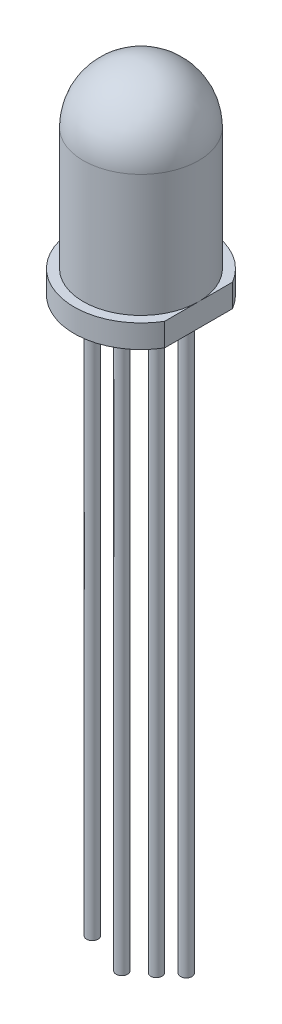
ISO-10303-21;
HEADER;
FILE_DESCRIPTION(('STEP AP214'),'2;1');
FILE_NAME('part.step','',(''),(''),'','','');
FILE_SCHEMA(('AUTOMOTIVE_DESIGN { 1 0 10303 214 1 1 1 1 }'));
ENDSEC;
DATA;
#1=APPLICATION_CONTEXT('core data for automotive mechanical design processes');
#2=APPLICATION_PROTOCOL_DEFINITION('international standard','automotive_design',2000,#1);
#3=PRODUCT_CONTEXT('',#1,'mechanical');
#4=PRODUCT('Part','Part','',(#3));
#5=PRODUCT_RELATED_PRODUCT_CATEGORY('part','',(#4));
#6=PRODUCT_DEFINITION_FORMATION('','',#4);
#7=PRODUCT_DEFINITION_CONTEXT('part definition',#1,'design');
#8=PRODUCT_DEFINITION('design','',#6,#7);
#9=PRODUCT_DEFINITION_SHAPE('','',#8);
#10=(LENGTH_UNIT() NAMED_UNIT(*) SI_UNIT(.MILLI.,.METRE.));
#11=(NAMED_UNIT(*) PLANE_ANGLE_UNIT() SI_UNIT($,.RADIAN.));
#12=(NAMED_UNIT(*) SI_UNIT($,.STERADIAN.) SOLID_ANGLE_UNIT());
#13=UNCERTAINTY_MEASURE_WITH_UNIT(LENGTH_MEASURE(1.E-05),#10,'distance_accuracy_value','');
#14=(GEOMETRIC_REPRESENTATION_CONTEXT(3) GLOBAL_UNCERTAINTY_ASSIGNED_CONTEXT((#13)) GLOBAL_UNIT_ASSIGNED_CONTEXT((#10,
#11,#12)) REPRESENTATION_CONTEXT('',''));
#15=CARTESIAN_POINT('',(0.,0.,0.));
#16=DIRECTION('',(0.,0.,1.));
#17=DIRECTION('',(1.,0.,0.));
#18=AXIS2_PLACEMENT_3D('',#15,#16,#17);
#19=CARTESIAN_POINT('',(0.,0.,0.));
#20=DIRECTION('',(0.,1.,0.));
#21=DIRECTION('',(1.,0.,0.));
#22=AXIS2_PLACEMENT_3D('',#19,#20,#21);
#23=SPHERICAL_SURFACE('',#22,2.5);
#24=CARTESIAN_POINT('',(0.,0.,0.));
#25=DIRECTION('',(0.,1.,0.));
#26=DIRECTION('',(-1.,0.,0.));
#27=AXIS2_PLACEMENT_3D('',#24,#25,#26);
#28=CIRCLE('',#27,2.5);
#29=CARTESIAN_POINT('',(-2.5,0.,0.));
#30=VERTEX_POINT('',#29);
#31=EDGE_CURVE('E110',#30,#30,#28,.T.);
#32=ORIENTED_EDGE('',*,*,#31,.T.);
#33=EDGE_LOOP('',(#32));
#34=FACE_BOUND('',#33,.T.);
#35=ADVANCED_FACE('F53',(#34),#23,.T.);
#36=CARTESIAN_POINT('',(0.,-6.3,0.));
#37=DIRECTION('',(0.,1.,0.));
#38=DIRECTION('',(-1.,0.,0.));
#39=AXIS2_PLACEMENT_3D('',#36,#37,#38);
#40=PLANE('',#39);
#41=CARTESIAN_POINT('',(-2.10983163233935,-6.3,0.));
#42=DIRECTION('',(0.,1.,0.));
#43=DIRECTION('',(-1.,0.,0.));
#44=AXIS2_PLACEMENT_3D('',#41,#42,#43);
#45=CIRCLE('',#44,0.25);
#46=CARTESIAN_POINT('',(-2.35983163233935,-6.3,0.));
#47=VERTEX_POINT('',#46);
#48=EDGE_CURVE('E125',#47,#47,#45,.F.);
#49=ORIENTED_EDGE('',*,*,#48,.F.);
#50=EDGE_LOOP('',(#49));
#51=FACE_BOUND('',#50,.T.);
#52=CARTESIAN_POINT('',(-0.828847000892224,-6.3,0.));
#53=DIRECTION('',(0.,1.,0.));
#54=DIRECTION('',(-1.,0.,0.));
#55=AXIS2_PLACEMENT_3D('',#52,#53,#54);
#56=CIRCLE('',#55,0.25);
#57=CARTESIAN_POINT('',(-1.07884700089222,-6.3,0.));
#58=VERTEX_POINT('',#57);
#59=EDGE_CURVE('E121',#58,#58,#56,.F.);
#60=ORIENTED_EDGE('',*,*,#59,.F.);
#61=EDGE_LOOP('',(#60));
#62=FACE_BOUND('',#61,.T.);
#63=CARTESIAN_POINT('',(0.669516840739869,-6.3,0.));
#64=DIRECTION('',(0.,1.,0.));
#65=DIRECTION('',(-1.,0.,0.));
#66=AXIS2_PLACEMENT_3D('',#63,#64,#65);
#67=CIRCLE('',#66,0.25);
#68=CARTESIAN_POINT('',(0.419516840739869,-6.3,0.));
#69=VERTEX_POINT('',#68);
#70=EDGE_CURVE('E117',#69,#69,#67,.F.);
#71=ORIENTED_EDGE('',*,*,#70,.F.);
#72=EDGE_LOOP('',(#71));
#73=FACE_BOUND('',#72,.T.);
#74=CARTESIAN_POINT('',(1.96602855862878,-6.3,0.));
#75=DIRECTION('',(0.,1.,0.));
#76=DIRECTION('',(-1.,0.,0.));
#77=AXIS2_PLACEMENT_3D('',#74,#75,#76);
#78=CIRCLE('',#77,0.25);
#79=CARTESIAN_POINT('',(1.71602855862878,-6.3,0.));
#80=VERTEX_POINT('',#79);
#81=EDGE_CURVE('E108',#80,#80,#78,.F.);
#82=ORIENTED_EDGE('',*,*,#81,.F.);
#83=EDGE_LOOP('',(#82));
#84=FACE_BOUND('',#83,.T.);
#85=CARTESIAN_POINT('',(0.,-6.3,0.));
#86=DIRECTION('',(0.,1.,0.));
#87=DIRECTION('',(-1.,0.,0.));
#88=AXIS2_PLACEMENT_3D('',#85,#86,#87);
#89=CIRCLE('',#88,2.9);
#90=CARTESIAN_POINT('',(2.5,-6.3,-1.46969384566991));
#91=VERTEX_POINT('',#90);
#92=CARTESIAN_POINT('',(2.5,-6.3,1.46969384566991));
#93=VERTEX_POINT('',#92);
#94=EDGE_CURVE('E98',#91,#93,#89,.T.);
#95=ORIENTED_EDGE('',*,*,#94,.F.);
#96=DIRECTION('',(0.,0.,-1.));
#97=VECTOR('',#96,1.);
#98=CARTESIAN_POINT('',(2.5,-6.3,-1.46969384566991));
#99=LINE('',#98,#97);
#100=EDGE_CURVE('E100',#93,#91,#99,.T.);
#101=ORIENTED_EDGE('',*,*,#100,.F.);
#102=EDGE_LOOP('',(#95,#101));
#103=FACE_BOUND('',#102,.T.);
#104=ADVANCED_FACE('F163',(#51,#62,#73,#84,#103),#40,.F.);
#105=CARTESIAN_POINT('',(0.,2.5,0.));
#106=DIRECTION('',(0.,1.,0.));
#107=DIRECTION('',(-1.,0.,0.));
#108=AXIS2_PLACEMENT_3D('',#105,#106,#107);
#109=CYLINDRICAL_SURFACE('',#108,2.9);
#110=ORIENTED_EDGE('',*,*,#94,.T.);
#111=DIRECTION('',(0.,-1.,0.));
#112=VECTOR('',#111,1.);
#113=CARTESIAN_POINT('',(2.5,2.501,1.46969384566991));
#114=LINE('',#113,#112);
#115=CARTESIAN_POINT('',(2.5,-5.3,1.46969384566991));
#116=VERTEX_POINT('',#115);
#117=EDGE_CURVE('E84',#116,#93,#114,.T.);
#118=ORIENTED_EDGE('',*,*,#117,.F.);
#119=CARTESIAN_POINT('',(0.,-5.3,0.));
#120=DIRECTION('',(0.,1.,0.));
#121=DIRECTION('',(-1.,0.,0.));
#122=AXIS2_PLACEMENT_3D('',#119,#120,#121);
#123=CIRCLE('',#122,2.9);
#124=CARTESIAN_POINT('',(2.5,-5.3,-1.46969384566991));
#125=VERTEX_POINT('',#124);
#126=EDGE_CURVE('E96',#125,#116,#123,.T.);
#127=ORIENTED_EDGE('',*,*,#126,.F.);
#128=DIRECTION('',(0.,-1.,0.));
#129=VECTOR('',#128,1.);
#130=CARTESIAN_POINT('',(2.5,2.501,-1.46969384566991));
#131=LINE('',#130,#129);
#132=EDGE_CURVE('E69',#125,#91,#131,.T.);
#133=ORIENTED_EDGE('',*,*,#132,.T.);
#134=EDGE_LOOP('',(#110,#118,#127,#133));
#135=FACE_BOUND('',#134,.T.);
#136=ADVANCED_FACE('F95',(#135),#109,.T.);
#137=CARTESIAN_POINT('',(2.9,-5.3,0.));
#138=DIRECTION('',(0.,-1.,0.));
#139=DIRECTION('',(1.,0.,0.));
#140=AXIS2_PLACEMENT_3D('',#137,#138,#139);
#141=PLANE('',#140);
#142=ORIENTED_EDGE('',*,*,#126,.T.);
#143=DIRECTION('',(0.,0.,1.));
#144=VECTOR('',#143,1.);
#145=CARTESIAN_POINT('',(2.5,-5.3,-1.46969384566991));
#146=LINE('',#145,#144);
#147=CARTESIAN_POINT('',(2.5,-5.3,0.));
#148=VERTEX_POINT('',#147);
#149=EDGE_CURVE('E81',#148,#116,#146,.T.);
#150=ORIENTED_EDGE('',*,*,#149,.F.);
#151=CARTESIAN_POINT('',(0.,-5.3,0.));
#152=DIRECTION('',(0.,1.,0.));
#153=DIRECTION('',(-1.,0.,0.));
#154=AXIS2_PLACEMENT_3D('',#151,#152,#153);
#155=CIRCLE('',#154,2.5);
#156=EDGE_CURVE('E104',#148,#148,#155,.T.);
#157=ORIENTED_EDGE('',*,*,#156,.F.);
#158=EDGE_CURVE('E73',#125,#148,#146,.T.);
#159=ORIENTED_EDGE('',*,*,#158,.F.);
#160=EDGE_LOOP('',(#142,#150,#157,#159));
#161=FACE_BOUND('',#160,.T.);
#162=ADVANCED_FACE('F102',(#161),#141,.F.);
#163=CARTESIAN_POINT('',(0.,2.5,0.));
#164=DIRECTION('',(0.,1.,0.));
#165=DIRECTION('',(-1.,0.,0.));
#166=AXIS2_PLACEMENT_3D('',#163,#164,#165);
#167=CYLINDRICAL_SURFACE('',#166,2.5);
#168=ORIENTED_EDGE('',*,*,#31,.F.);
#169=EDGE_LOOP('',(#168));
#170=FACE_BOUND('',#169,.T.);
#171=ORIENTED_EDGE('',*,*,#156,.T.);
#172=EDGE_LOOP('',(#171));
#173=FACE_BOUND('',#172,.T.);
#174=ADVANCED_FACE('F151',(#170,#173),#167,.T.);
#175=CARTESIAN_POINT('',(2.5,2.501,-1.46969384566991));
#176=DIRECTION('',(-1.,0.,0.));
#177=DIRECTION('',(0.,-1.,0.));
#178=AXIS2_PLACEMENT_3D('',#175,#176,#177);
#179=PLANE('',#178);
#180=ORIENTED_EDGE('',*,*,#158,.T.);
#181=ORIENTED_EDGE('',*,*,#149,.T.);
#182=ORIENTED_EDGE('',*,*,#117,.T.);
#183=ORIENTED_EDGE('',*,*,#100,.T.);
#184=ORIENTED_EDGE('',*,*,#132,.F.);
#185=EDGE_LOOP('',(#180,#181,#182,#183,#184));
#186=FACE_BOUND('',#185,.T.);
#187=ADVANCED_FACE('F83',(#186),#179,.F.);
#188=CARTESIAN_POINT('',(1.96602855862878,-32.8,0.));
#189=DIRECTION('',(0.,1.,0.));
#190=DIRECTION('',(-1.,0.,0.));
#191=AXIS2_PLACEMENT_3D('',#188,#189,#190);
#192=CYLINDRICAL_SURFACE('',#191,0.25);
#193=CARTESIAN_POINT('',(1.96602855862878,-30.8017377383294,0.));
#194=DIRECTION('',(0.,1.,0.));
#195=DIRECTION('',(0.,0.,1.));
#196=AXIS2_PLACEMENT_3D('',#193,#194,#195);
#197=CIRCLE('',#196,0.25);
#198=CARTESIAN_POINT('',(1.96602855862878,-30.8017377383294,0.25));
#199=VERTEX_POINT('',#198);
#200=EDGE_CURVE('E56',#199,#199,#197,.T.);
#201=ORIENTED_EDGE('',*,*,#200,.T.);
#202=EDGE_LOOP('',(#201));
#203=FACE_BOUND('',#202,.T.);
#204=ORIENTED_EDGE('',*,*,#81,.T.);
#205=EDGE_LOOP('',(#204));
#206=FACE_BOUND('',#205,.T.);
#207=ADVANCED_FACE('F159',(#203,#206),#192,.T.);
#208=CARTESIAN_POINT('',(0.669516840739872,-32.8,0.));
#209=DIRECTION('',(0.,1.,0.));
#210=DIRECTION('',(-1.,0.,0.));
#211=AXIS2_PLACEMENT_3D('',#208,#209,#210);
#212=CYLINDRICAL_SURFACE('',#211,0.25);
#213=CARTESIAN_POINT('',(0.669516840739872,-31.4366469746687,0.));
#214=DIRECTION('',(0.,1.,0.));
#215=DIRECTION('',(0.,0.,1.));
#216=AXIS2_PLACEMENT_3D('',#213,#214,#215);
#217=CIRCLE('',#216,0.25);
#218=CARTESIAN_POINT('',(0.669516840739872,-31.4366469746687,0.25));
#219=VERTEX_POINT('',#218);
#220=EDGE_CURVE('E13',#219,#219,#217,.T.);
#221=ORIENTED_EDGE('',*,*,#220,.T.);
#222=EDGE_LOOP('',(#221));
#223=FACE_BOUND('',#222,.T.);
#224=ORIENTED_EDGE('',*,*,#70,.T.);
#225=EDGE_LOOP('',(#224));
#226=FACE_BOUND('',#225,.T.);
#227=ADVANCED_FACE('F182',(#223,#226),#212,.T.);
#228=CARTESIAN_POINT('',(-0.82884700089222,-32.8,0.));
#229=DIRECTION('',(0.,1.,0.));
#230=DIRECTION('',(-1.,0.,0.));
#231=AXIS2_PLACEMENT_3D('',#228,#229,#230);
#232=CYLINDRICAL_SURFACE('',#231,0.25);
#233=CARTESIAN_POINT('',(-0.82884700089222,-32.1125992848152,0.));
#234=DIRECTION('',(0.,1.,0.));
#235=DIRECTION('',(0.,0.,1.));
#236=AXIS2_PLACEMENT_3D('',#233,#234,#235);
#237=CIRCLE('',#236,0.25);
#238=CARTESIAN_POINT('',(-0.82884700089222,-32.1125992848152,0.25));
#239=VERTEX_POINT('',#238);
#240=EDGE_CURVE('E132',#239,#239,#237,.T.);
#241=ORIENTED_EDGE('',*,*,#240,.T.);
#242=EDGE_LOOP('',(#241));
#243=FACE_BOUND('',#242,.T.);
#244=ORIENTED_EDGE('',*,*,#59,.T.);
#245=EDGE_LOOP('',(#244));
#246=FACE_BOUND('',#245,.T.);
#247=ADVANCED_FACE('F187',(#243,#246),#232,.T.);
#248=CARTESIAN_POINT('',(-2.10983163233935,-32.8,0.));
#249=DIRECTION('',(0.,1.,0.));
#250=DIRECTION('',(-1.,0.,0.));
#251=AXIS2_PLACEMENT_3D('',#248,#249,#250);
#252=CYLINDRICAL_SURFACE('',#251,0.25);
#253=CARTESIAN_POINT('',(-2.10983163233935,-31.4366469746687,0.));
#254=DIRECTION('',(0.,1.,0.));
#255=DIRECTION('',(0.,0.,1.));
#256=AXIS2_PLACEMENT_3D('',#253,#254,#255);
#257=CIRCLE('',#256,0.25);
#258=CARTESIAN_POINT('',(-2.10983163233935,-31.4366469746687,0.25));
#259=VERTEX_POINT('',#258);
#260=EDGE_CURVE('E62',#259,#259,#257,.T.);
#261=ORIENTED_EDGE('',*,*,#260,.T.);
#262=EDGE_LOOP('',(#261));
#263=FACE_BOUND('',#262,.T.);
#264=ORIENTED_EDGE('',*,*,#48,.T.);
#265=EDGE_LOOP('',(#264));
#266=FACE_BOUND('',#265,.T.);
#267=ADVANCED_FACE('F193',(#263,#266),#252,.T.);
#268=CARTESIAN_POINT('',(-1.85983163233935,-31.4366469746687,-2.9));
#269=DIRECTION('',(0.,1.,0.));
#270=DIRECTION('',(0.,0.,1.));
#271=AXIS2_PLACEMENT_3D('',#268,#269,#270);
#272=PLANE('',#271);
#273=ORIENTED_EDGE('',*,*,#260,.F.);
#274=EDGE_LOOP('',(#273));
#275=FACE_BOUND('',#274,.T.);
#276=ADVANCED_FACE('F196',(#275),#272,.F.);
#277=CARTESIAN_POINT('',(-0.318229125149116,-32.1125992848152,-2.9));
#278=DIRECTION('',(0.,1.,0.));
#279=DIRECTION('',(0.,0.,1.));
#280=AXIS2_PLACEMENT_3D('',#277,#278,#279);
#281=PLANE('',#280);
#282=ORIENTED_EDGE('',*,*,#240,.F.);
#283=EDGE_LOOP('',(#282));
#284=FACE_BOUND('',#283,.T.);
#285=ADVANCED_FACE('F205',(#284),#281,.F.);
#286=CARTESIAN_POINT('',(0.919516840739872,-31.4366469746687,-2.9));
#287=DIRECTION('',(0.,1.,0.));
#288=DIRECTION('',(0.,0.,1.));
#289=AXIS2_PLACEMENT_3D('',#286,#287,#288);
#290=PLANE('',#289);
#291=ORIENTED_EDGE('',*,*,#220,.F.);
#292=EDGE_LOOP('',(#291));
#293=FACE_BOUND('',#292,.T.);
#294=ADVANCED_FACE('F201',(#293),#290,.F.);
#295=CARTESIAN_POINT('',(2.21602855862878,-30.8017377383294,-2.9));
#296=DIRECTION('',(0.,1.,0.));
#297=DIRECTION('',(0.,0.,1.));
#298=AXIS2_PLACEMENT_3D('',#295,#296,#297);
#299=PLANE('',#298);
#300=ORIENTED_EDGE('',*,*,#200,.F.);
#301=EDGE_LOOP('',(#300));
#302=FACE_BOUND('',#301,.T.);
#303=ADVANCED_FACE('F198',(#302),#299,.F.);
#304=CLOSED_SHELL('',(#35,#104,#136,#162,#174,#187,#207,#227,#247,#267,#276,#285,#294,#303));
#305=MANIFOLD_SOLID_BREP('B2',#304);
#306=ADVANCED_BREP_SHAPE_REPRESENTATION('',(#18,#305),#14);
#307=SHAPE_DEFINITION_REPRESENTATION(#9,#306);
ENDSEC;
END-ISO-10303-21;
